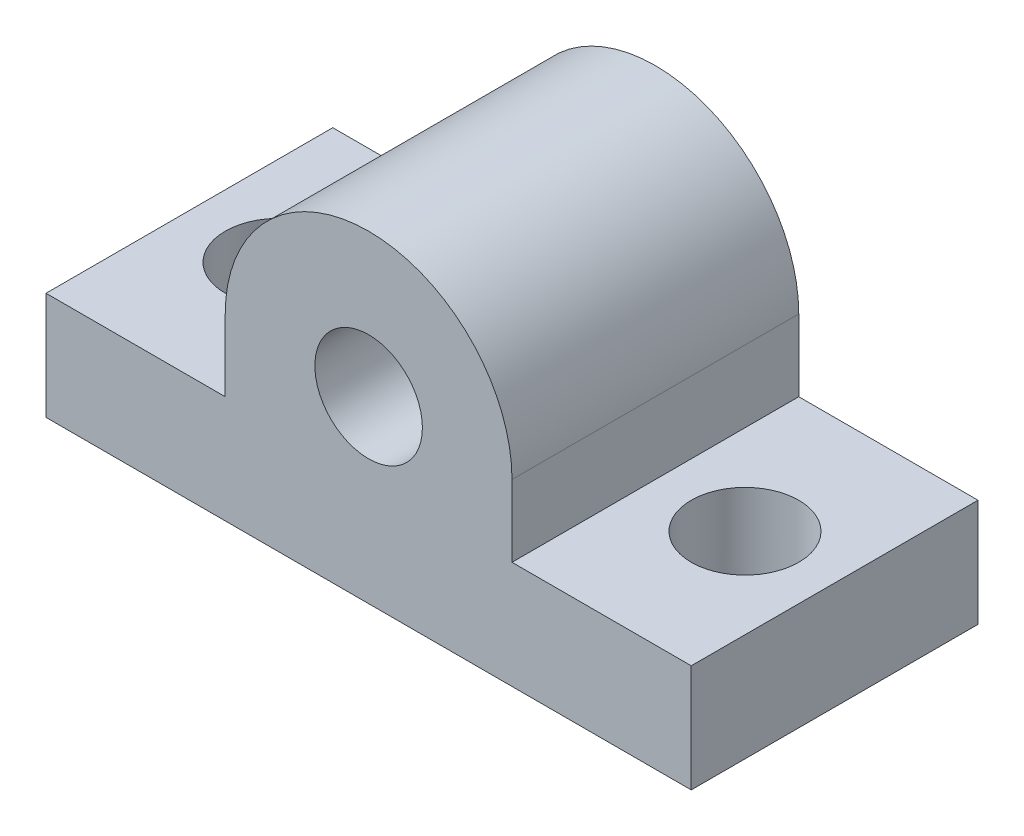
ISO-10303-21;
HEADER;
FILE_DESCRIPTION(('STEP AP214'),'2;1');
FILE_NAME('part.step','',(''),(''),'','','');
FILE_SCHEMA(('AUTOMOTIVE_DESIGN { 1 0 10303 214 1 1 1 1 }'));
ENDSEC;
DATA;
#1=APPLICATION_CONTEXT('core data for automotive mechanical design processes');
#2=APPLICATION_PROTOCOL_DEFINITION('international standard','automotive_design',2000,#1);
#3=PRODUCT_CONTEXT('',#1,'mechanical');
#4=PRODUCT('Part','Part','',(#3));
#5=PRODUCT_RELATED_PRODUCT_CATEGORY('part','',(#4));
#6=PRODUCT_DEFINITION_FORMATION('','',#4);
#7=PRODUCT_DEFINITION_CONTEXT('part definition',#1,'design');
#8=PRODUCT_DEFINITION('design','',#6,#7);
#9=PRODUCT_DEFINITION_SHAPE('','',#8);
#10=(LENGTH_UNIT() NAMED_UNIT(*) SI_UNIT(.MILLI.,.METRE.));
#11=(NAMED_UNIT(*) PLANE_ANGLE_UNIT() SI_UNIT($,.RADIAN.));
#12=(NAMED_UNIT(*) SI_UNIT($,.STERADIAN.) SOLID_ANGLE_UNIT());
#13=UNCERTAINTY_MEASURE_WITH_UNIT(LENGTH_MEASURE(1.E-05),#10,'distance_accuracy_value','');
#14=(GEOMETRIC_REPRESENTATION_CONTEXT(3) GLOBAL_UNCERTAINTY_ASSIGNED_CONTEXT((#13)) GLOBAL_UNIT_ASSIGNED_CONTEXT((#10,
#11,#12)) REPRESENTATION_CONTEXT('',''));
#15=CARTESIAN_POINT('',(0.,0.,0.));
#16=DIRECTION('',(0.,0.,1.));
#17=DIRECTION('',(1.,0.,0.));
#18=AXIS2_PLACEMENT_3D('',#15,#16,#17);
#19=CARTESIAN_POINT('',(0.,0.,8.));
#20=DIRECTION('',(-1.,0.,0.));
#21=DIRECTION('',(0.,-1.,0.));
#22=AXIS2_PLACEMENT_3D('',#19,#20,#21);
#23=PLANE('',#22);
#24=DIRECTION('',(0.,1.,0.));
#25=VECTOR('',#24,1.);
#26=CARTESIAN_POINT('',(0.,0.,0.));
#27=LINE('',#26,#25);
#28=CARTESIAN_POINT('',(0.,3.,0.));
#29=VERTEX_POINT('',#28);
#30=CARTESIAN_POINT('',(0.,5.,0.));
#31=VERTEX_POINT('',#30);
#32=EDGE_CURVE('E116',#29,#31,#27,.T.);
#33=ORIENTED_EDGE('',*,*,#32,.F.);
#34=DIRECTION('',(0.,0.,-1.));
#35=VECTOR('',#34,1.);
#36=CARTESIAN_POINT('',(0.,3.,0.));
#37=LINE('',#36,#35);
#38=CARTESIAN_POINT('',(0.,3.,8.));
#39=VERTEX_POINT('',#38);
#40=EDGE_CURVE('E129',#39,#29,#37,.T.);
#41=ORIENTED_EDGE('',*,*,#40,.F.);
#42=DIRECTION('',(0.,1.,0.));
#43=VECTOR('',#42,1.);
#44=CARTESIAN_POINT('',(0.,0.,8.));
#45=LINE('',#44,#43);
#46=CARTESIAN_POINT('',(0.,5.,8.));
#47=VERTEX_POINT('',#46);
#48=EDGE_CURVE('E167',#39,#47,#45,.T.);
#49=ORIENTED_EDGE('',*,*,#48,.T.);
#50=DIRECTION('',(0.,0.,-1.));
#51=VECTOR('',#50,1.);
#52=CARTESIAN_POINT('',(0.,5.,8.));
#53=LINE('',#52,#51);
#54=EDGE_CURVE('E11',#47,#31,#53,.T.);
#55=ORIENTED_EDGE('',*,*,#54,.T.);
#56=EDGE_LOOP('',(#33,#41,#49,#55));
#57=FACE_BOUND('',#56,.T.);
#58=ADVANCED_FACE('F37',(#57),#23,.T.);
#59=CARTESIAN_POINT('',(8.,0.,8.));
#60=DIRECTION('',(-1.,0.,0.));
#61=DIRECTION('',(0.,0.,1.));
#62=AXIS2_PLACEMENT_3D('',#59,#60,#61);
#63=PLANE('',#62);
#64=DIRECTION('',(0.,0.,1.));
#65=VECTOR('',#64,1.);
#66=CARTESIAN_POINT('',(8.,3.,0.));
#67=LINE('',#66,#65);
#68=CARTESIAN_POINT('',(8.,3.,0.));
#69=VERTEX_POINT('',#68);
#70=CARTESIAN_POINT('',(8.,3.,8.));
#71=VERTEX_POINT('',#70);
#72=EDGE_CURVE('E147',#69,#71,#67,.T.);
#73=ORIENTED_EDGE('',*,*,#72,.F.);
#74=DIRECTION('',(0.,1.,0.));
#75=VECTOR('',#74,1.);
#76=CARTESIAN_POINT('',(8.,0.,0.));
#77=LINE('',#76,#75);
#78=CARTESIAN_POINT('',(8.,5.,0.));
#79=VERTEX_POINT('',#78);
#80=EDGE_CURVE('E115',#69,#79,#77,.T.);
#81=ORIENTED_EDGE('',*,*,#80,.T.);
#82=DIRECTION('',(0.,0.,-1.));
#83=VECTOR('',#82,1.);
#84=CARTESIAN_POINT('',(8.,5.,8.));
#85=LINE('',#84,#83);
#86=CARTESIAN_POINT('',(8.,5.,8.));
#87=VERTEX_POINT('',#86);
#88=EDGE_CURVE('E45',#87,#79,#85,.T.);
#89=ORIENTED_EDGE('',*,*,#88,.F.);
#90=DIRECTION('',(0.,1.,0.));
#91=VECTOR('',#90,1.);
#92=CARTESIAN_POINT('',(8.,0.,8.));
#93=LINE('',#92,#91);
#94=EDGE_CURVE('E60',#71,#87,#93,.T.);
#95=ORIENTED_EDGE('',*,*,#94,.F.);
#96=EDGE_LOOP('',(#73,#81,#89,#95));
#97=FACE_BOUND('',#96,.T.);
#98=ADVANCED_FACE('F196',(#97),#63,.F.);
#99=CARTESIAN_POINT('',(4.,5.,8.));
#100=DIRECTION('',(0.,0.,-1.));
#101=DIRECTION('',(-1.,0.,0.));
#102=AXIS2_PLACEMENT_3D('',#99,#100,#101);
#103=CYLINDRICAL_SURFACE('',#102,4.);
#104=CARTESIAN_POINT('',(4.,5.,0.));
#105=DIRECTION('',(0.,0.,1.));
#106=DIRECTION('',(1.,0.,0.));
#107=AXIS2_PLACEMENT_3D('',#104,#105,#106);
#108=CIRCLE('',#107,4.);
#109=EDGE_CURVE('E163',#79,#31,#108,.T.);
#110=ORIENTED_EDGE('',*,*,#109,.T.);
#111=ORIENTED_EDGE('',*,*,#54,.F.);
#112=CARTESIAN_POINT('',(4.,5.,8.));
#113=DIRECTION('',(0.,0.,1.));
#114=DIRECTION('',(1.,0.,0.));
#115=AXIS2_PLACEMENT_3D('',#112,#113,#114);
#116=CIRCLE('',#115,4.);
#117=EDGE_CURVE('E164',#87,#47,#116,.T.);
#118=ORIENTED_EDGE('',*,*,#117,.F.);
#119=ORIENTED_EDGE('',*,*,#88,.T.);
#120=EDGE_LOOP('',(#110,#111,#118,#119));
#121=FACE_BOUND('',#120,.T.);
#122=ADVANCED_FACE('F39',(#121),#103,.T.);
#123=CARTESIAN_POINT('',(0.,0.,8.));
#124=DIRECTION('',(0.,1.,0.));
#125=DIRECTION('',(-1.,0.,0.));
#126=AXIS2_PLACEMENT_3D('',#123,#124,#125);
#127=PLANE('',#126);
#128=CARTESIAN_POINT('',(-2.5,0.,4.));
#129=DIRECTION('',(0.,1.,0.));
#130=DIRECTION('',(-1.,0.,0.));
#131=AXIS2_PLACEMENT_3D('',#128,#129,#130);
#132=CIRCLE('',#131,1.5);
#133=CARTESIAN_POINT('',(-4.,0.,4.));
#134=VERTEX_POINT('',#133);
#135=EDGE_CURVE('E131',#134,#134,#132,.F.);
#136=ORIENTED_EDGE('',*,*,#135,.F.);
#137=EDGE_LOOP('',(#136));
#138=FACE_BOUND('',#137,.T.);
#139=CARTESIAN_POINT('',(10.5,0.,4.));
#140=DIRECTION('',(0.,1.,0.));
#141=DIRECTION('',(-1.,0.,0.));
#142=AXIS2_PLACEMENT_3D('',#139,#140,#141);
#143=CIRCLE('',#142,1.5);
#144=CARTESIAN_POINT('',(9.,0.,4.));
#145=VERTEX_POINT('',#144);
#146=EDGE_CURVE('E144',#145,#145,#143,.F.);
#147=ORIENTED_EDGE('',*,*,#146,.F.);
#148=EDGE_LOOP('',(#147));
#149=FACE_BOUND('',#148,.T.);
#150=DIRECTION('',(1.,0.,0.));
#151=VECTOR('',#150,1.);
#152=CARTESIAN_POINT('',(0.,0.,0.));
#153=LINE('',#152,#151);
#154=CARTESIAN_POINT('',(-5.,0.,0.));
#155=VERTEX_POINT('',#154);
#156=CARTESIAN_POINT('',(13.,0.,0.));
#157=VERTEX_POINT('',#156);
#158=EDGE_CURVE('E102',#155,#157,#153,.T.);
#159=ORIENTED_EDGE('',*,*,#158,.T.);
#160=DIRECTION('',(0.,0.,-1.));
#161=VECTOR('',#160,1.);
#162=CARTESIAN_POINT('',(13.,0.,0.));
#163=LINE('',#162,#161);
#164=CARTESIAN_POINT('',(13.,0.,8.));
#165=VERTEX_POINT('',#164);
#166=EDGE_CURVE('E154',#165,#157,#163,.T.);
#167=ORIENTED_EDGE('',*,*,#166,.F.);
#168=DIRECTION('',(1.,0.,0.));
#169=VECTOR('',#168,1.);
#170=CARTESIAN_POINT('',(0.,0.,8.));
#171=LINE('',#170,#169);
#172=CARTESIAN_POINT('',(-5.,0.,8.));
#173=VERTEX_POINT('',#172);
#174=EDGE_CURVE('E121',#173,#165,#171,.T.);
#175=ORIENTED_EDGE('',*,*,#174,.F.);
#176=DIRECTION('',(0.,0.,1.));
#177=VECTOR('',#176,1.);
#178=CARTESIAN_POINT('',(-5.,0.,0.));
#179=LINE('',#178,#177);
#180=EDGE_CURVE('E119',#155,#173,#179,.T.);
#181=ORIENTED_EDGE('',*,*,#180,.F.);
#182=EDGE_LOOP('',(#159,#167,#175,#181));
#183=FACE_BOUND('',#182,.T.);
#184=ADVANCED_FACE('F120',(#138,#149,#183),#127,.F.);
#185=CARTESIAN_POINT('',(4.,5.,8.));
#186=DIRECTION('',(0.,0.,-1.));
#187=DIRECTION('',(-1.,0.,0.));
#188=AXIS2_PLACEMENT_3D('',#185,#186,#187);
#189=CYLINDRICAL_SURFACE('',#188,1.5);
#190=CARTESIAN_POINT('',(4.,5.,8.));
#191=DIRECTION('',(0.,0.,1.));
#192=DIRECTION('',(1.,0.,0.));
#193=AXIS2_PLACEMENT_3D('',#190,#191,#192);
#194=CIRCLE('',#193,1.5);
#195=CARTESIAN_POINT('',(5.5,5.,8.));
#196=VERTEX_POINT('',#195);
#197=EDGE_CURVE('E172',#196,#196,#194,.T.);
#198=ORIENTED_EDGE('',*,*,#197,.T.);
#199=EDGE_LOOP('',(#198));
#200=FACE_BOUND('',#199,.T.);
#201=CARTESIAN_POINT('',(4.,5.,0.));
#202=DIRECTION('',(0.,0.,1.));
#203=DIRECTION('',(1.,0.,0.));
#204=AXIS2_PLACEMENT_3D('',#201,#202,#203);
#205=CIRCLE('',#204,1.5);
#206=CARTESIAN_POINT('',(5.5,5.,0.));
#207=VERTEX_POINT('',#206);
#208=EDGE_CURVE('E168',#207,#207,#205,.T.);
#209=ORIENTED_EDGE('',*,*,#208,.F.);
#210=EDGE_LOOP('',(#209));
#211=FACE_BOUND('',#210,.T.);
#212=ADVANCED_FACE('F205',(#200,#211),#189,.F.);
#213=CARTESIAN_POINT('',(0.,0.,8.));
#214=DIRECTION('',(0.,0.,1.));
#215=DIRECTION('',(1.,0.,0.));
#216=AXIS2_PLACEMENT_3D('',#213,#214,#215);
#217=PLANE('',#216);
#218=ORIENTED_EDGE('',*,*,#117,.T.);
#219=ORIENTED_EDGE('',*,*,#48,.F.);
#220=DIRECTION('',(1.,0.,0.));
#221=VECTOR('',#220,1.);
#222=CARTESIAN_POINT('',(-5.,3.,8.));
#223=LINE('',#222,#221);
#224=CARTESIAN_POINT('',(-5.,3.,8.));
#225=VERTEX_POINT('',#224);
#226=EDGE_CURVE('E139',#225,#39,#223,.T.);
#227=ORIENTED_EDGE('',*,*,#226,.F.);
#228=DIRECTION('',(0.,1.,0.));
#229=VECTOR('',#228,1.);
#230=CARTESIAN_POINT('',(-5.,0.,8.));
#231=LINE('',#230,#229);
#232=EDGE_CURVE('E124',#173,#225,#231,.T.);
#233=ORIENTED_EDGE('',*,*,#232,.F.);
#234=ORIENTED_EDGE('',*,*,#174,.T.);
#235=DIRECTION('',(0.,-1.,0.));
#236=VECTOR('',#235,1.);
#237=CARTESIAN_POINT('',(13.,0.,8.));
#238=LINE('',#237,#236);
#239=CARTESIAN_POINT('',(13.,3.,8.));
#240=VERTEX_POINT('',#239);
#241=EDGE_CURVE('E151',#240,#165,#238,.T.);
#242=ORIENTED_EDGE('',*,*,#241,.F.);
#243=DIRECTION('',(-1.,0.,0.));
#244=VECTOR('',#243,1.);
#245=CARTESIAN_POINT('',(13.,3.,8.));
#246=LINE('',#245,#244);
#247=EDGE_CURVE('E156',#240,#71,#246,.T.);
#248=ORIENTED_EDGE('',*,*,#247,.T.);
#249=ORIENTED_EDGE('',*,*,#94,.T.);
#250=EDGE_LOOP('',(#218,#219,#227,#233,#234,#242,#248,#249));
#251=FACE_BOUND('',#250,.T.);
#252=ORIENTED_EDGE('',*,*,#197,.F.);
#253=EDGE_LOOP('',(#252));
#254=FACE_BOUND('',#253,.T.);
#255=ADVANCED_FACE('F190',(#251,#254),#217,.T.);
#256=CARTESIAN_POINT('',(0.,0.,0.));
#257=DIRECTION('',(0.,0.,1.));
#258=DIRECTION('',(1.,0.,0.));
#259=AXIS2_PLACEMENT_3D('',#256,#257,#258);
#260=PLANE('',#259);
#261=ORIENTED_EDGE('',*,*,#109,.F.);
#262=ORIENTED_EDGE('',*,*,#80,.F.);
#263=DIRECTION('',(-1.,0.,0.));
#264=VECTOR('',#263,1.);
#265=CARTESIAN_POINT('',(13.,3.,0.));
#266=LINE('',#265,#264);
#267=CARTESIAN_POINT('',(13.,3.,0.));
#268=VERTEX_POINT('',#267);
#269=EDGE_CURVE('E160',#268,#69,#266,.T.);
#270=ORIENTED_EDGE('',*,*,#269,.F.);
#271=DIRECTION('',(0.,1.,0.));
#272=VECTOR('',#271,1.);
#273=CARTESIAN_POINT('',(13.,0.,0.));
#274=LINE('',#273,#272);
#275=EDGE_CURVE('E111',#157,#268,#274,.T.);
#276=ORIENTED_EDGE('',*,*,#275,.F.);
#277=ORIENTED_EDGE('',*,*,#158,.F.);
#278=DIRECTION('',(0.,-1.,0.));
#279=VECTOR('',#278,1.);
#280=CARTESIAN_POINT('',(-5.,0.,0.));
#281=LINE('',#280,#279);
#282=CARTESIAN_POINT('',(-5.,3.,0.));
#283=VERTEX_POINT('',#282);
#284=EDGE_CURVE('E108',#283,#155,#281,.T.);
#285=ORIENTED_EDGE('',*,*,#284,.F.);
#286=DIRECTION('',(1.,0.,0.));
#287=VECTOR('',#286,1.);
#288=CARTESIAN_POINT('',(-5.,3.,0.));
#289=LINE('',#288,#287);
#290=EDGE_CURVE('E52',#283,#29,#289,.T.);
#291=ORIENTED_EDGE('',*,*,#290,.T.);
#292=ORIENTED_EDGE('',*,*,#32,.T.);
#293=EDGE_LOOP('',(#261,#262,#270,#276,#277,#285,#291,#292));
#294=FACE_BOUND('',#293,.T.);
#295=ORIENTED_EDGE('',*,*,#208,.T.);
#296=EDGE_LOOP('',(#295));
#297=FACE_BOUND('',#296,.T.);
#298=ADVANCED_FACE('F105',(#294,#297),#260,.F.);
#299=CARTESIAN_POINT('',(13.,3.,0.));
#300=DIRECTION('',(0.,-1.,0.));
#301=DIRECTION('',(0.,0.,-1.));
#302=AXIS2_PLACEMENT_3D('',#299,#300,#301);
#303=PLANE('',#302);
#304=CARTESIAN_POINT('',(10.5,3.,4.));
#305=DIRECTION('',(0.,1.,0.));
#306=DIRECTION('',(0.,0.,1.));
#307=AXIS2_PLACEMENT_3D('',#304,#305,#306);
#308=CIRCLE('',#307,1.5);
#309=CARTESIAN_POINT('',(10.5,3.,5.5));
#310=VERTEX_POINT('',#309);
#311=EDGE_CURVE('E141',#310,#310,#308,.T.);
#312=ORIENTED_EDGE('',*,*,#311,.F.);
#313=EDGE_LOOP('',(#312));
#314=FACE_BOUND('',#313,.T.);
#315=ORIENTED_EDGE('',*,*,#72,.T.);
#316=ORIENTED_EDGE('',*,*,#247,.F.);
#317=DIRECTION('',(0.,0.,1.));
#318=VECTOR('',#317,1.);
#319=CARTESIAN_POINT('',(13.,3.,0.));
#320=LINE('',#319,#318);
#321=EDGE_CURVE('E149',#268,#240,#320,.T.);
#322=ORIENTED_EDGE('',*,*,#321,.F.);
#323=ORIENTED_EDGE('',*,*,#269,.T.);
#324=EDGE_LOOP('',(#315,#316,#322,#323));
#325=FACE_BOUND('',#324,.T.);
#326=ADVANCED_FACE('F195',(#314,#325),#303,.F.);
#327=CARTESIAN_POINT('',(13.,0.,0.));
#328=DIRECTION('',(1.,0.,0.));
#329=DIRECTION('',(0.,0.,-1.));
#330=AXIS2_PLACEMENT_3D('',#327,#328,#329);
#331=PLANE('',#330);
#332=ORIENTED_EDGE('',*,*,#275,.T.);
#333=ORIENTED_EDGE('',*,*,#321,.T.);
#334=ORIENTED_EDGE('',*,*,#241,.T.);
#335=ORIENTED_EDGE('',*,*,#166,.T.);
#336=EDGE_LOOP('',(#332,#333,#334,#335));
#337=FACE_BOUND('',#336,.T.);
#338=ADVANCED_FACE('F221',(#337),#331,.T.);
#339=CARTESIAN_POINT('',(10.5,-0.00100000000000143,4.));
#340=DIRECTION('',(0.,1.,0.));
#341=DIRECTION('',(0.,0.,1.));
#342=AXIS2_PLACEMENT_3D('',#339,#340,#341);
#343=CYLINDRICAL_SURFACE('',#342,1.5);
#344=ORIENTED_EDGE('',*,*,#311,.T.);
#345=EDGE_LOOP('',(#344));
#346=FACE_BOUND('',#345,.T.);
#347=ORIENTED_EDGE('',*,*,#146,.T.);
#348=EDGE_LOOP('',(#347));
#349=FACE_BOUND('',#348,.T.);
#350=ADVANCED_FACE('F218',(#346,#349),#343,.F.);
#351=CARTESIAN_POINT('',(-5.,3.,0.));
#352=DIRECTION('',(0.,-1.,0.));
#353=DIRECTION('',(1.,0.,0.));
#354=AXIS2_PLACEMENT_3D('',#351,#352,#353);
#355=PLANE('',#354);
#356=CARTESIAN_POINT('',(-2.5,3.,4.));
#357=DIRECTION('',(0.,1.,0.));
#358=DIRECTION('',(-1.,0.,0.));
#359=AXIS2_PLACEMENT_3D('',#356,#357,#358);
#360=CIRCLE('',#359,1.5);
#361=CARTESIAN_POINT('',(-4.,3.,4.));
#362=VERTEX_POINT('',#361);
#363=EDGE_CURVE('E331',#362,#362,#360,.T.);
#364=ORIENTED_EDGE('',*,*,#363,.F.);
#365=EDGE_LOOP('',(#364));
#366=FACE_BOUND('',#365,.T.);
#367=ORIENTED_EDGE('',*,*,#40,.T.);
#368=ORIENTED_EDGE('',*,*,#290,.F.);
#369=DIRECTION('',(0.,0.,-1.));
#370=VECTOR('',#369,1.);
#371=CARTESIAN_POINT('',(-5.,3.,0.));
#372=LINE('',#371,#370);
#373=EDGE_CURVE('E128',#225,#283,#372,.T.);
#374=ORIENTED_EDGE('',*,*,#373,.F.);
#375=ORIENTED_EDGE('',*,*,#226,.T.);
#376=EDGE_LOOP('',(#367,#368,#374,#375));
#377=FACE_BOUND('',#376,.T.);
#378=ADVANCED_FACE('F220',(#366,#377),#355,.F.);
#379=CARTESIAN_POINT('',(-5.,0.,0.));
#380=DIRECTION('',(1.,0.,0.));
#381=DIRECTION('',(0.,1.,0.));
#382=AXIS2_PLACEMENT_3D('',#379,#380,#381);
#383=PLANE('',#382);
#384=ORIENTED_EDGE('',*,*,#284,.T.);
#385=ORIENTED_EDGE('',*,*,#180,.T.);
#386=ORIENTED_EDGE('',*,*,#232,.T.);
#387=ORIENTED_EDGE('',*,*,#373,.T.);
#388=EDGE_LOOP('',(#384,#385,#386,#387));
#389=FACE_BOUND('',#388,.T.);
#390=ADVANCED_FACE('F126',(#389),#383,.F.);
#391=CARTESIAN_POINT('',(-2.5,-0.00100000000000751,4.));
#392=DIRECTION('',(0.,1.,0.));
#393=DIRECTION('',(-1.,0.,0.));
#394=AXIS2_PLACEMENT_3D('',#391,#392,#393);
#395=CYLINDRICAL_SURFACE('',#394,1.5);
#396=ORIENTED_EDGE('',*,*,#363,.T.);
#397=EDGE_LOOP('',(#396));
#398=FACE_BOUND('',#397,.T.);
#399=ORIENTED_EDGE('',*,*,#135,.T.);
#400=EDGE_LOOP('',(#399));
#401=FACE_BOUND('',#400,.T.);
#402=ADVANCED_FACE('F317',(#398,#401),#395,.F.);
#403=CLOSED_SHELL('',(#58,#98,#122,#184,#212,#255,#298,#326,#338,#350,#378,#390,#402));
#404=MANIFOLD_SOLID_BREP('B2',#403);
#405=ADVANCED_BREP_SHAPE_REPRESENTATION('',(#18,#404),#14);
#406=SHAPE_DEFINITION_REPRESENTATION(#9,#405);
ENDSEC;
END-ISO-10303-21;
